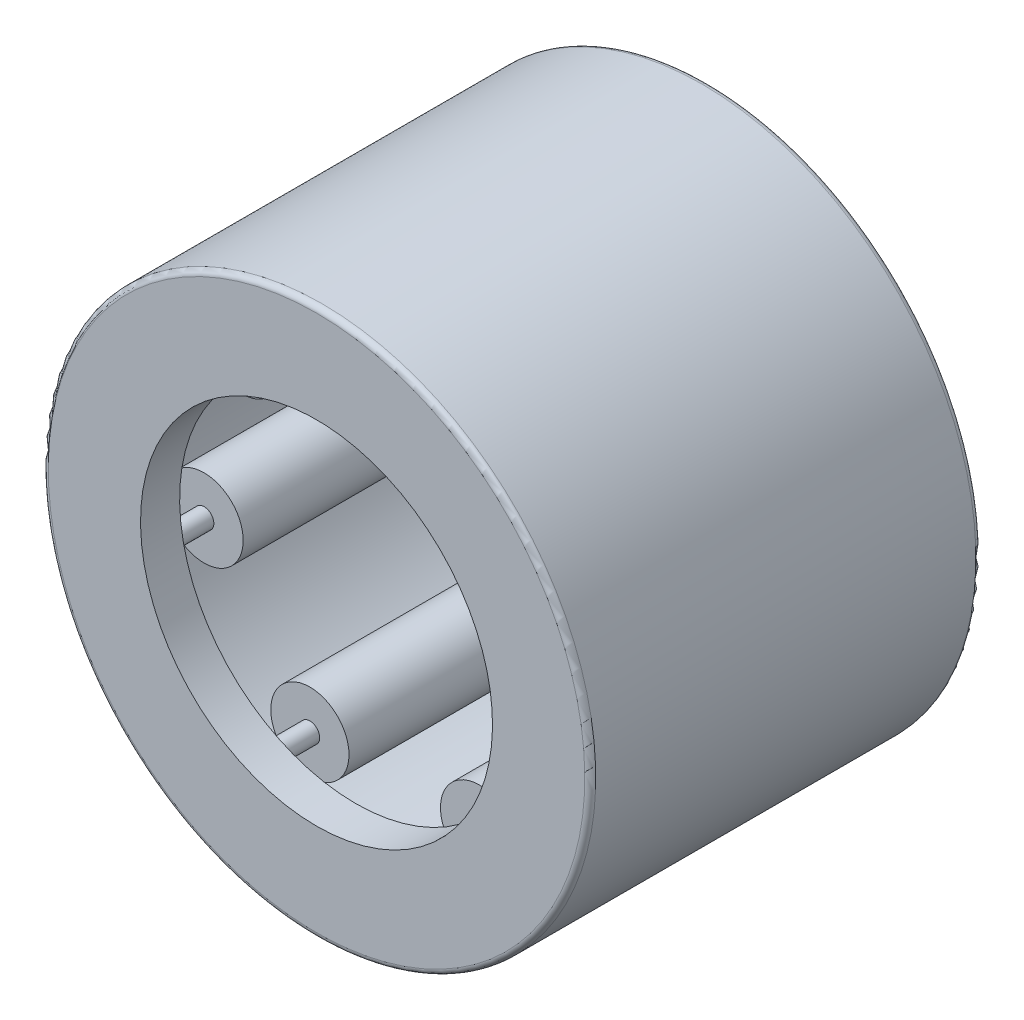
ISO-10303-21;
HEADER;
FILE_DESCRIPTION(('STEP AP214'),'2;1');
FILE_NAME('part.step','',(''),(''),'','','');
FILE_SCHEMA(('AUTOMOTIVE_DESIGN { 1 0 10303 214 1 1 1 1 }'));
ENDSEC;
DATA;
#1=APPLICATION_CONTEXT('core data for automotive mechanical design processes');
#2=APPLICATION_PROTOCOL_DEFINITION('international standard','automotive_design',2000,#1);
#3=PRODUCT_CONTEXT('',#1,'mechanical');
#4=PRODUCT('Part','Part','',(#3));
#5=PRODUCT_RELATED_PRODUCT_CATEGORY('part','',(#4));
#6=PRODUCT_DEFINITION_FORMATION('','',#4);
#7=PRODUCT_DEFINITION_CONTEXT('part definition',#1,'design');
#8=PRODUCT_DEFINITION('design','',#6,#7);
#9=PRODUCT_DEFINITION_SHAPE('','',#8);
#10=(LENGTH_UNIT() NAMED_UNIT(*) SI_UNIT(.MILLI.,.METRE.));
#11=(NAMED_UNIT(*) PLANE_ANGLE_UNIT() SI_UNIT($,.RADIAN.));
#12=(NAMED_UNIT(*) SI_UNIT($,.STERADIAN.) SOLID_ANGLE_UNIT());
#13=UNCERTAINTY_MEASURE_WITH_UNIT(LENGTH_MEASURE(1.E-05),#10,'distance_accuracy_value','');
#14=(GEOMETRIC_REPRESENTATION_CONTEXT(3) GLOBAL_UNCERTAINTY_ASSIGNED_CONTEXT((#13)) GLOBAL_UNIT_ASSIGNED_CONTEXT((#10,
#11,#12)) REPRESENTATION_CONTEXT('',''));
#15=CARTESIAN_POINT('',(0.,0.,0.));
#16=DIRECTION('',(0.,0.,1.));
#17=DIRECTION('',(1.,0.,0.));
#18=AXIS2_PLACEMENT_3D('',#15,#16,#17);
#19=CARTESIAN_POINT('',(-3.10289369604496,2.47447515112688,3.175));
#20=DIRECTION('',(0.,0.,-1.));
#21=DIRECTION('',(-0.623489801858743,-0.781831482468022,0.));
#22=AXIS2_PLACEMENT_3D('',#19,#20,#21);
#23=PLANE('',#22);
#24=CARTESIAN_POINT('',(-3.10289369604496,2.47447515112688,3.175));
#25=DIRECTION('',(0.,0.,1.));
#26=DIRECTION('',(0.623489801858743,0.781831482468022,0.));
#27=AXIS2_PLACEMENT_3D('',#24,#25,#26);
#28=CIRCLE('',#27,0.198437499999999);
#29=CARTESIAN_POINT('',(-2.97916993848861,2.62961983592913,3.175));
#30=VERTEX_POINT('',#29);
#31=EDGE_CURVE('E11',#30,#30,#28,.T.);
#32=ORIENTED_EDGE('',*,*,#31,.T.);
#33=EDGE_LOOP('',(#32));
#34=FACE_BOUND('',#33,.T.);
#35=ADVANCED_FACE('F48',(#34),#23,.F.);
#36=CARTESIAN_POINT('',(-3.10289369604496,2.47447515112688,3.175));
#37=DIRECTION('',(0.,0.,1.));
#38=DIRECTION('',(0.623489801858743,0.781831482468022,0.));
#39=AXIS2_PLACEMENT_3D('',#36,#37,#38);
#40=CYLINDRICAL_SURFACE('',#39,0.198437499999999);
#41=ORIENTED_EDGE('',*,*,#31,.F.);
#42=EDGE_LOOP('',(#41));
#43=FACE_BOUND('',#42,.T.);
#44=CARTESIAN_POINT('',(-3.10289369604496,2.47447515112688,-3.175));
#45=DIRECTION('',(0.,0.,1.));
#46=DIRECTION('',(0.623489801858743,0.781831482468022,0.));
#47=AXIS2_PLACEMENT_3D('',#44,#45,#46);
#48=CIRCLE('',#47,0.198437499999999);
#49=CARTESIAN_POINT('',(-2.97916993848861,2.62961983592913,-3.175));
#50=VERTEX_POINT('',#49);
#51=EDGE_CURVE('E54',#50,#50,#48,.T.);
#52=ORIENTED_EDGE('',*,*,#51,.T.);
#53=EDGE_LOOP('',(#52));
#54=FACE_BOUND('',#53,.T.);
#55=ADVANCED_FACE('F60',(#43,#54),#40,.T.);
#56=CARTESIAN_POINT('',(-3.10289369604496,2.47447515112688,-3.175));
#57=DIRECTION('',(0.,0.,1.));
#58=DIRECTION('',(0.623489801858743,0.781831482468022,0.));
#59=AXIS2_PLACEMENT_3D('',#56,#57,#58);
#60=PLANE('',#59);
#61=ORIENTED_EDGE('',*,*,#51,.F.);
#62=EDGE_LOOP('',(#61));
#63=FACE_BOUND('',#62,.T.);
#64=ADVANCED_FACE('F62',(#63),#60,.F.);
#65=CLOSED_SHELL('',(#35,#55,#64));
#66=MANIFOLD_SOLID_BREP('B2',#65);
#67=CARTESIAN_POINT('',(-3.86924515147161,-0.883129956639084,3.175));
#68=DIRECTION('',(0.,0.,-1.));
#69=DIRECTION('',(0.222520933956305,-0.974927912181826,0.));
#70=AXIS2_PLACEMENT_3D('',#67,#68,#69);
#71=PLANE('',#70);
#72=CARTESIAN_POINT('',(-3.86924515147161,-0.883129956639084,3.175));
#73=DIRECTION('',(0.,0.,1.));
#74=DIRECTION('',(-0.222520933956305,0.974927912181826,0.));
#75=AXIS2_PLACEMENT_3D('',#72,#73,#74);
#76=CIRCLE('',#75,0.198437499999999);
#77=CARTESIAN_POINT('',(-3.91340164930357,-0.689667699065504,3.175));
#78=VERTEX_POINT('',#77);
#79=EDGE_CURVE('E47',#78,#78,#76,.T.);
#80=ORIENTED_EDGE('',*,*,#79,.T.);
#81=EDGE_LOOP('',(#80));
#82=FACE_BOUND('',#81,.T.);
#83=ADVANCED_FACE('F97',(#82),#71,.F.);
#84=CARTESIAN_POINT('',(-3.86924515147161,-0.883129956639084,3.175));
#85=DIRECTION('',(0.,0.,1.));
#86=DIRECTION('',(-0.222520933956305,0.974927912181826,0.));
#87=AXIS2_PLACEMENT_3D('',#84,#85,#86);
#88=CYLINDRICAL_SURFACE('',#87,0.198437499999999);
#89=ORIENTED_EDGE('',*,*,#79,.F.);
#90=EDGE_LOOP('',(#89));
#91=FACE_BOUND('',#90,.T.);
#92=CARTESIAN_POINT('',(-3.86924515147161,-0.883129956639084,-3.175));
#93=DIRECTION('',(0.,0.,1.));
#94=DIRECTION('',(-0.222520933956305,0.974927912181826,0.));
#95=AXIS2_PLACEMENT_3D('',#92,#93,#94);
#96=CIRCLE('',#95,0.198437499999999);
#97=CARTESIAN_POINT('',(-3.91340164930357,-0.689667699065504,-3.175));
#98=VERTEX_POINT('',#97);
#99=EDGE_CURVE('E103',#98,#98,#96,.T.);
#100=ORIENTED_EDGE('',*,*,#99,.T.);
#101=EDGE_LOOP('',(#100));
#102=FACE_BOUND('',#101,.T.);
#103=ADVANCED_FACE('F109',(#91,#102),#88,.T.);
#104=CARTESIAN_POINT('',(-3.86924515147161,-0.883129956639084,-3.175));
#105=DIRECTION('',(0.,0.,1.));
#106=DIRECTION('',(-0.222520933956305,0.974927912181826,0.));
#107=AXIS2_PLACEMENT_3D('',#104,#105,#106);
#108=PLANE('',#107);
#109=ORIENTED_EDGE('',*,*,#99,.F.);
#110=EDGE_LOOP('',(#109));
#111=FACE_BOUND('',#110,.T.);
#112=ADVANCED_FACE('F111',(#111),#108,.F.);
#113=CLOSED_SHELL('',(#83,#103,#112));
#114=MANIFOLD_SOLID_BREP('B6',#113);
#115=CARTESIAN_POINT('',(-1.72197608962283,-3.57572019448771,3.175));
#116=DIRECTION('',(0.,0.,-1.));
#117=DIRECTION('',(0.900968867902416,-0.433883739117565,0.));
#118=AXIS2_PLACEMENT_3D('',#115,#116,#117);
#119=PLANE('',#118);
#120=CARTESIAN_POINT('',(-1.72197608962283,-3.57572019448771,3.175));
#121=DIRECTION('',(0.,0.,1.));
#122=DIRECTION('',(-0.900968867902416,0.433883739117565,0.));
#123=AXIS2_PLACEMENT_3D('',#120,#121,#122);
#124=CIRCLE('',#123,0.198437499999999);
#125=CARTESIAN_POINT('',(-1.90076209934722,-3.48962139000656,3.175));
#126=VERTEX_POINT('',#125);
#127=EDGE_CURVE('E96',#126,#126,#124,.T.);
#128=ORIENTED_EDGE('',*,*,#127,.T.);
#129=EDGE_LOOP('',(#128));
#130=FACE_BOUND('',#129,.T.);
#131=ADVANCED_FACE('F146',(#130),#119,.F.);
#132=CARTESIAN_POINT('',(-1.72197608962283,-3.57572019448771,3.175));
#133=DIRECTION('',(0.,0.,1.));
#134=DIRECTION('',(-0.900968867902416,0.433883739117565,0.));
#135=AXIS2_PLACEMENT_3D('',#132,#133,#134);
#136=CYLINDRICAL_SURFACE('',#135,0.198437499999999);
#137=ORIENTED_EDGE('',*,*,#127,.F.);
#138=EDGE_LOOP('',(#137));
#139=FACE_BOUND('',#138,.T.);
#140=CARTESIAN_POINT('',(-1.72197608962283,-3.57572019448771,-3.175));
#141=DIRECTION('',(0.,0.,1.));
#142=DIRECTION('',(-0.900968867902416,0.433883739117565,0.));
#143=AXIS2_PLACEMENT_3D('',#140,#141,#142);
#144=CIRCLE('',#143,0.198437499999999);
#145=CARTESIAN_POINT('',(-1.90076209934722,-3.48962139000656,-3.175));
#146=VERTEX_POINT('',#145);
#147=EDGE_CURVE('E152',#146,#146,#144,.T.);
#148=ORIENTED_EDGE('',*,*,#147,.T.);
#149=EDGE_LOOP('',(#148));
#150=FACE_BOUND('',#149,.T.);
#151=ADVANCED_FACE('F158',(#139,#150),#136,.T.);
#152=CARTESIAN_POINT('',(-1.72197608962283,-3.57572019448771,-3.175));
#153=DIRECTION('',(0.,0.,1.));
#154=DIRECTION('',(-0.900968867902416,0.433883739117565,0.));
#155=AXIS2_PLACEMENT_3D('',#152,#153,#154);
#156=PLANE('',#155);
#157=ORIENTED_EDGE('',*,*,#147,.F.);
#158=EDGE_LOOP('',(#157));
#159=FACE_BOUND('',#158,.T.);
#160=ADVANCED_FACE('F160',(#159),#156,.F.);
#161=CLOSED_SHELL('',(#131,#151,#160));
#162=MANIFOLD_SOLID_BREP('B42',#161);
#163=CARTESIAN_POINT('',(1.72197608962278,-3.57572019448773,3.175));
#164=DIRECTION('',(0.,0.,-1.));
#165=DIRECTION('',(0.900968867902422,0.433883739117553,0.));
#166=AXIS2_PLACEMENT_3D('',#163,#164,#165);
#167=PLANE('',#166);
#168=CARTESIAN_POINT('',(1.72197608962278,-3.57572019448773,3.175));
#169=DIRECTION('',(0.,0.,1.));
#170=DIRECTION('',(-0.900968867902422,-0.433883739117553,0.));
#171=AXIS2_PLACEMENT_3D('',#168,#169,#170);
#172=CIRCLE('',#171,0.198437499999999);
#173=CARTESIAN_POINT('',(1.5431900798984,-3.66181899896887,3.175));
#174=VERTEX_POINT('',#173);
#175=EDGE_CURVE('E145',#174,#174,#172,.T.);
#176=ORIENTED_EDGE('',*,*,#175,.T.);
#177=EDGE_LOOP('',(#176));
#178=FACE_BOUND('',#177,.T.);
#179=ADVANCED_FACE('F195',(#178),#167,.F.);
#180=CARTESIAN_POINT('',(1.72197608962278,-3.57572019448773,3.175));
#181=DIRECTION('',(0.,0.,1.));
#182=DIRECTION('',(-0.900968867902422,-0.433883739117553,0.));
#183=AXIS2_PLACEMENT_3D('',#180,#181,#182);
#184=CYLINDRICAL_SURFACE('',#183,0.198437499999999);
#185=ORIENTED_EDGE('',*,*,#175,.F.);
#186=EDGE_LOOP('',(#185));
#187=FACE_BOUND('',#186,.T.);
#188=CARTESIAN_POINT('',(1.72197608962278,-3.57572019448773,-3.175));
#189=DIRECTION('',(0.,0.,1.));
#190=DIRECTION('',(-0.900968867902422,-0.433883739117553,0.));
#191=AXIS2_PLACEMENT_3D('',#188,#189,#190);
#192=CIRCLE('',#191,0.198437499999999);
#193=CARTESIAN_POINT('',(1.5431900798984,-3.66181899896887,-3.175));
#194=VERTEX_POINT('',#193);
#195=EDGE_CURVE('E201',#194,#194,#192,.T.);
#196=ORIENTED_EDGE('',*,*,#195,.T.);
#197=EDGE_LOOP('',(#196));
#198=FACE_BOUND('',#197,.T.);
#199=ADVANCED_FACE('F207',(#187,#198),#184,.T.);
#200=CARTESIAN_POINT('',(1.72197608962278,-3.57572019448773,-3.175));
#201=DIRECTION('',(0.,0.,1.));
#202=DIRECTION('',(-0.900968867902422,-0.433883739117553,0.));
#203=AXIS2_PLACEMENT_3D('',#200,#201,#202);
#204=PLANE('',#203);
#205=ORIENTED_EDGE('',*,*,#195,.F.);
#206=EDGE_LOOP('',(#205));
#207=FACE_BOUND('',#206,.T.);
#208=ADVANCED_FACE('F209',(#207),#204,.F.);
#209=CLOSED_SHELL('',(#179,#199,#208));
#210=MANIFOLD_SOLID_BREP('B91',#209);
#211=CARTESIAN_POINT('',(3.8692451514716,-0.883129956639136,3.175));
#212=DIRECTION('',(0.,0.,-1.));
#213=DIRECTION('',(0.222520933956318,0.974927912181823,0.));
#214=AXIS2_PLACEMENT_3D('',#211,#212,#213);
#215=PLANE('',#214);
#216=CARTESIAN_POINT('',(3.8692451514716,-0.883129956639136,3.175));
#217=DIRECTION('',(0.,0.,1.));
#218=DIRECTION('',(-0.222520933956318,-0.974927912181823,0.));
#219=AXIS2_PLACEMENT_3D('',#216,#217,#218);
#220=CIRCLE('',#219,0.198437499999999);
#221=CARTESIAN_POINT('',(3.82508865363965,-1.07659221421272,3.175));
#222=VERTEX_POINT('',#221);
#223=EDGE_CURVE('E194',#222,#222,#220,.T.);
#224=ORIENTED_EDGE('',*,*,#223,.T.);
#225=EDGE_LOOP('',(#224));
#226=FACE_BOUND('',#225,.T.);
#227=ADVANCED_FACE('F244',(#226),#215,.F.);
#228=CARTESIAN_POINT('',(3.8692451514716,-0.883129956639136,3.175));
#229=DIRECTION('',(0.,0.,1.));
#230=DIRECTION('',(-0.222520933956318,-0.974927912181823,0.));
#231=AXIS2_PLACEMENT_3D('',#228,#229,#230);
#232=CYLINDRICAL_SURFACE('',#231,0.198437499999999);
#233=ORIENTED_EDGE('',*,*,#223,.F.);
#234=EDGE_LOOP('',(#233));
#235=FACE_BOUND('',#234,.T.);
#236=CARTESIAN_POINT('',(3.8692451514716,-0.883129956639136,-3.175));
#237=DIRECTION('',(0.,0.,1.));
#238=DIRECTION('',(-0.222520933956318,-0.974927912181823,0.));
#239=AXIS2_PLACEMENT_3D('',#236,#237,#238);
#240=CIRCLE('',#239,0.198437499999999);
#241=CARTESIAN_POINT('',(3.82508865363965,-1.07659221421272,-3.175));
#242=VERTEX_POINT('',#241);
#243=EDGE_CURVE('E250',#242,#242,#240,.T.);
#244=ORIENTED_EDGE('',*,*,#243,.T.);
#245=EDGE_LOOP('',(#244));
#246=FACE_BOUND('',#245,.T.);
#247=ADVANCED_FACE('F256',(#235,#246),#232,.T.);
#248=CARTESIAN_POINT('',(3.8692451514716,-0.883129956639136,-3.175));
#249=DIRECTION('',(0.,0.,1.));
#250=DIRECTION('',(-0.222520933956318,-0.974927912181823,0.));
#251=AXIS2_PLACEMENT_3D('',#248,#249,#250);
#252=PLANE('',#251);
#253=ORIENTED_EDGE('',*,*,#243,.F.);
#254=EDGE_LOOP('',(#253));
#255=FACE_BOUND('',#254,.T.);
#256=ADVANCED_FACE('F258',(#255),#252,.F.);
#257=CLOSED_SHELL('',(#227,#247,#256));
#258=MANIFOLD_SOLID_BREP('B140',#257);
#259=CARTESIAN_POINT('',(3.10289369604499,2.47447515112684,3.175));
#260=DIRECTION('',(0.,0.,-1.));
#261=DIRECTION('',(-0.623489801858732,0.781831482468031,0.));
#262=AXIS2_PLACEMENT_3D('',#259,#260,#261);
#263=PLANE('',#262);
#264=CARTESIAN_POINT('',(3.10289369604499,2.47447515112684,3.175));
#265=DIRECTION('',(0.,0.,1.));
#266=DIRECTION('',(0.623489801858732,-0.781831482468031,0.));
#267=AXIS2_PLACEMENT_3D('',#264,#265,#266);
#268=CIRCLE('',#267,0.198437499999999);
#269=CARTESIAN_POINT('',(3.22661745360133,2.31933046632459,3.175));
#270=VERTEX_POINT('',#269);
#271=EDGE_CURVE('E243',#270,#270,#268,.T.);
#272=ORIENTED_EDGE('',*,*,#271,.T.);
#273=EDGE_LOOP('',(#272));
#274=FACE_BOUND('',#273,.T.);
#275=ADVANCED_FACE('F293',(#274),#263,.F.);
#276=CARTESIAN_POINT('',(3.10289369604499,2.47447515112684,3.175));
#277=DIRECTION('',(0.,0.,1.));
#278=DIRECTION('',(0.623489801858732,-0.781831482468031,0.));
#279=AXIS2_PLACEMENT_3D('',#276,#277,#278);
#280=CYLINDRICAL_SURFACE('',#279,0.198437499999999);
#281=ORIENTED_EDGE('',*,*,#271,.F.);
#282=EDGE_LOOP('',(#281));
#283=FACE_BOUND('',#282,.T.);
#284=CARTESIAN_POINT('',(3.10289369604499,2.47447515112684,-3.175));
#285=DIRECTION('',(0.,0.,1.));
#286=DIRECTION('',(0.623489801858732,-0.781831482468031,0.));
#287=AXIS2_PLACEMENT_3D('',#284,#285,#286);
#288=CIRCLE('',#287,0.198437499999999);
#289=CARTESIAN_POINT('',(3.22661745360133,2.31933046632459,-3.175));
#290=VERTEX_POINT('',#289);
#291=EDGE_CURVE('E299',#290,#290,#288,.T.);
#292=ORIENTED_EDGE('',*,*,#291,.T.);
#293=EDGE_LOOP('',(#292));
#294=FACE_BOUND('',#293,.T.);
#295=ADVANCED_FACE('F305',(#283,#294),#280,.T.);
#296=CARTESIAN_POINT('',(3.10289369604499,2.47447515112684,-3.175));
#297=DIRECTION('',(0.,0.,1.));
#298=DIRECTION('',(0.623489801858732,-0.781831482468031,0.));
#299=AXIS2_PLACEMENT_3D('',#296,#297,#298);
#300=PLANE('',#299);
#301=ORIENTED_EDGE('',*,*,#291,.F.);
#302=EDGE_LOOP('',(#301));
#303=FACE_BOUND('',#302,.T.);
#304=ADVANCED_FACE('F307',(#303),#300,.F.);
#305=CLOSED_SHELL('',(#275,#295,#304));
#306=MANIFOLD_SOLID_BREP('B189',#305);
#307=CARTESIAN_POINT('',(-3.72347243525395,2.96937018135226,-2.38125));
#308=DIRECTION('',(0.,0.,1.));
#309=DIRECTION('',(0.623489801858743,0.781831482468022,0.));
#310=AXIS2_PLACEMENT_3D('',#307,#308,#309);
#311=PLANE('',#310);
#312=CARTESIAN_POINT('',(-3.10289369604496,2.47447515112688,-2.38125));
#313=DIRECTION('',(0.,0.,1.));
#314=DIRECTION('',(0.623489801858743,0.781831482468022,0.));
#315=AXIS2_PLACEMENT_3D('',#312,#313,#314);
#316=CIRCLE('',#315,0.793749999999996);
#317=CARTESIAN_POINT('',(-2.60799866581958,3.09505389033587,-2.38125));
#318=VERTEX_POINT('',#317);
#319=EDGE_CURVE('E356',#318,#318,#316,.T.);
#320=ORIENTED_EDGE('',*,*,#319,.F.);
#321=EDGE_LOOP('',(#320));
#322=FACE_BOUND('',#321,.T.);
#323=CARTESIAN_POINT('',(-3.10289369604496,2.47447515112688,-2.38125));
#324=DIRECTION('',(0.,0.,1.));
#325=DIRECTION('',(0.623489801858743,0.781831482468022,0.));
#326=AXIS2_PLACEMENT_3D('',#323,#324,#325);
#327=CIRCLE('',#326,0.198437499999999);
#328=CARTESIAN_POINT('',(-2.97916993848861,2.62961983592913,-2.38125));
#329=VERTEX_POINT('',#328);
#330=EDGE_CURVE('E292',#329,#329,#327,.T.);
#331=ORIENTED_EDGE('',*,*,#330,.T.);
#332=EDGE_LOOP('',(#331));
#333=FACE_BOUND('',#332,.T.);
#334=ADVANCED_FACE('F342',(#322,#333),#311,.F.);
#335=CARTESIAN_POINT('',(-3.10289369604496,2.47447515112688,2.38125));
#336=DIRECTION('',(0.,0.,1.));
#337=DIRECTION('',(0.623489801858743,0.781831482468022,0.));
#338=AXIS2_PLACEMENT_3D('',#335,#336,#337);
#339=CYLINDRICAL_SURFACE('',#338,0.198437499999999);
#340=ORIENTED_EDGE('',*,*,#330,.F.);
#341=EDGE_LOOP('',(#340));
#342=FACE_BOUND('',#341,.T.);
#343=CARTESIAN_POINT('',(-3.10289369604496,2.47447515112688,2.38125));
#344=DIRECTION('',(0.,0.,1.));
#345=DIRECTION('',(0.623489801858743,0.781831482468022,0.));
#346=AXIS2_PLACEMENT_3D('',#343,#344,#345);
#347=CIRCLE('',#346,0.198437499999999);
#348=CARTESIAN_POINT('',(-2.97916993848861,2.62961983592913,2.38125));
#349=VERTEX_POINT('',#348);
#350=EDGE_CURVE('E348',#349,#349,#347,.T.);
#351=ORIENTED_EDGE('',*,*,#350,.T.);
#352=EDGE_LOOP('',(#351));
#353=FACE_BOUND('',#352,.T.);
#354=ADVANCED_FACE('F365',(#342,#353),#339,.F.);
#355=CARTESIAN_POINT('',(-3.72347243525395,2.96937018135226,2.38125));
#356=DIRECTION('',(0.,0.,-1.));
#357=DIRECTION('',(-0.623489801858743,-0.781831482468022,0.));
#358=AXIS2_PLACEMENT_3D('',#355,#356,#357);
#359=PLANE('',#358);
#360=ORIENTED_EDGE('',*,*,#350,.F.);
#361=EDGE_LOOP('',(#360));
#362=FACE_BOUND('',#361,.T.);
#363=CARTESIAN_POINT('',(-3.10289369604496,2.47447515112688,2.38125));
#364=DIRECTION('',(0.,0.,1.));
#365=DIRECTION('',(0.623489801858743,0.781831482468022,0.));
#366=AXIS2_PLACEMENT_3D('',#363,#364,#365);
#367=CIRCLE('',#366,0.793749999999996);
#368=CARTESIAN_POINT('',(-2.60799866581958,3.09505389033587,2.38125));
#369=VERTEX_POINT('',#368);
#370=EDGE_CURVE('E352',#369,#369,#367,.T.);
#371=ORIENTED_EDGE('',*,*,#370,.T.);
#372=EDGE_LOOP('',(#371));
#373=FACE_BOUND('',#372,.T.);
#374=ADVANCED_FACE('F369',(#362,#373),#359,.F.);
#375=CARTESIAN_POINT('',(-3.10289369604496,2.47447515112688,2.38125));
#376=DIRECTION('',(0.,0.,1.));
#377=DIRECTION('',(0.623489801858743,0.781831482468022,0.));
#378=AXIS2_PLACEMENT_3D('',#375,#376,#377);
#379=CYLINDRICAL_SURFACE('',#378,0.793749999999996);
#380=ORIENTED_EDGE('',*,*,#370,.F.);
#381=EDGE_LOOP('',(#380));
#382=FACE_BOUND('',#381,.T.);
#383=ORIENTED_EDGE('',*,*,#319,.T.);
#384=EDGE_LOOP('',(#383));
#385=FACE_BOUND('',#384,.T.);
#386=ADVANCED_FACE('F362',(#382,#385),#379,.T.);
#387=CLOSED_SHELL('',(#334,#354,#374,#386));
#388=MANIFOLD_SOLID_BREP('B238',#387);
#389=CARTESIAN_POINT('',(-4.64309418176593,-1.0597559479669,-2.38125));
#390=DIRECTION('',(0.,0.,1.));
#391=DIRECTION('',(-0.222520933956305,0.974927912181826,0.));
#392=AXIS2_PLACEMENT_3D('',#389,#390,#391);
#393=PLANE('',#392);
#394=CARTESIAN_POINT('',(-3.86924515147161,-0.883129956639084,-2.38125));
#395=DIRECTION('',(0.,0.,1.));
#396=DIRECTION('',(-0.222520933956305,0.974927912181826,0.));
#397=AXIS2_PLACEMENT_3D('',#394,#395,#396);
#398=CIRCLE('',#397,0.793749999999996);
#399=CARTESIAN_POINT('',(-4.04587114279943,-0.109280926344764,-2.38125));
#400=VERTEX_POINT('',#399);
#401=EDGE_CURVE('E426',#400,#400,#398,.T.);
#402=ORIENTED_EDGE('',*,*,#401,.F.);
#403=EDGE_LOOP('',(#402));
#404=FACE_BOUND('',#403,.T.);
#405=CARTESIAN_POINT('',(-3.86924515147161,-0.883129956639084,-2.38125));
#406=DIRECTION('',(0.,0.,1.));
#407=DIRECTION('',(-0.222520933956305,0.974927912181826,0.));
#408=AXIS2_PLACEMENT_3D('',#405,#406,#407);
#409=CIRCLE('',#408,0.198437499999999);
#410=CARTESIAN_POINT('',(-3.91340164930357,-0.689667699065504,-2.38125));
#411=VERTEX_POINT('',#410);
#412=EDGE_CURVE('E341',#411,#411,#409,.T.);
#413=ORIENTED_EDGE('',*,*,#412,.T.);
#414=EDGE_LOOP('',(#413));
#415=FACE_BOUND('',#414,.T.);
#416=ADVANCED_FACE('F412',(#404,#415),#393,.F.);
#417=CARTESIAN_POINT('',(-3.86924515147161,-0.883129956639084,2.38125));
#418=DIRECTION('',(0.,0.,1.));
#419=DIRECTION('',(-0.222520933956305,0.974927912181826,0.));
#420=AXIS2_PLACEMENT_3D('',#417,#418,#419);
#421=CYLINDRICAL_SURFACE('',#420,0.198437499999999);
#422=ORIENTED_EDGE('',*,*,#412,.F.);
#423=EDGE_LOOP('',(#422));
#424=FACE_BOUND('',#423,.T.);
#425=CARTESIAN_POINT('',(-3.86924515147161,-0.883129956639084,2.38125));
#426=DIRECTION('',(0.,0.,1.));
#427=DIRECTION('',(-0.222520933956305,0.974927912181826,0.));
#428=AXIS2_PLACEMENT_3D('',#425,#426,#427);
#429=CIRCLE('',#428,0.198437499999999);
#430=CARTESIAN_POINT('',(-3.91340164930357,-0.689667699065504,2.38125));
#431=VERTEX_POINT('',#430);
#432=EDGE_CURVE('E418',#431,#431,#429,.T.);
#433=ORIENTED_EDGE('',*,*,#432,.T.);
#434=EDGE_LOOP('',(#433));
#435=FACE_BOUND('',#434,.T.);
#436=ADVANCED_FACE('F435',(#424,#435),#421,.F.);
#437=CARTESIAN_POINT('',(-4.64309418176593,-1.0597559479669,2.38125));
#438=DIRECTION('',(0.,0.,-1.));
#439=DIRECTION('',(0.222520933956305,-0.974927912181826,0.));
#440=AXIS2_PLACEMENT_3D('',#437,#438,#439);
#441=PLANE('',#440);
#442=ORIENTED_EDGE('',*,*,#432,.F.);
#443=EDGE_LOOP('',(#442));
#444=FACE_BOUND('',#443,.T.);
#445=CARTESIAN_POINT('',(-3.86924515147161,-0.883129956639084,2.38125));
#446=DIRECTION('',(0.,0.,1.));
#447=DIRECTION('',(-0.222520933956305,0.974927912181826,0.));
#448=AXIS2_PLACEMENT_3D('',#445,#446,#447);
#449=CIRCLE('',#448,0.793749999999996);
#450=CARTESIAN_POINT('',(-4.04587114279943,-0.109280926344764,2.38125));
#451=VERTEX_POINT('',#450);
#452=EDGE_CURVE('E422',#451,#451,#449,.T.);
#453=ORIENTED_EDGE('',*,*,#452,.T.);
#454=EDGE_LOOP('',(#453));
#455=FACE_BOUND('',#454,.T.);
#456=ADVANCED_FACE('F439',(#444,#455),#441,.F.);
#457=CARTESIAN_POINT('',(-3.86924515147161,-0.883129956639084,2.38125));
#458=DIRECTION('',(0.,0.,1.));
#459=DIRECTION('',(-0.222520933956305,0.974927912181826,0.));
#460=AXIS2_PLACEMENT_3D('',#457,#458,#459);
#461=CYLINDRICAL_SURFACE('',#460,0.793749999999996);
#462=ORIENTED_EDGE('',*,*,#452,.F.);
#463=EDGE_LOOP('',(#462));
#464=FACE_BOUND('',#463,.T.);
#465=ORIENTED_EDGE('',*,*,#401,.T.);
#466=EDGE_LOOP('',(#465));
#467=FACE_BOUND('',#466,.T.);
#468=ADVANCED_FACE('F432',(#464,#467),#461,.T.);
#469=CLOSED_SHELL('',(#416,#436,#456,#468));
#470=MANIFOLD_SOLID_BREP('B287',#469);
#471=CARTESIAN_POINT('',(-2.0663713075474,-4.29086423338524,-2.38125));
#472=DIRECTION('',(0.,0.,1.));
#473=DIRECTION('',(-0.900968867902416,0.433883739117565,0.));
#474=AXIS2_PLACEMENT_3D('',#471,#472,#473);
#475=PLANE('',#474);
#476=CARTESIAN_POINT('',(-1.72197608962283,-3.57572019448771,-2.38125));
#477=DIRECTION('',(0.,0.,1.));
#478=DIRECTION('',(-0.900968867902416,0.433883739117565,0.));
#479=AXIS2_PLACEMENT_3D('',#476,#477,#478);
#480=CIRCLE('',#479,0.793749999999996);
#481=CARTESIAN_POINT('',(-2.43712012852037,-3.23132497656314,-2.38125));
#482=VERTEX_POINT('',#481);
#483=EDGE_CURVE('E496',#482,#482,#480,.T.);
#484=ORIENTED_EDGE('',*,*,#483,.F.);
#485=EDGE_LOOP('',(#484));
#486=FACE_BOUND('',#485,.T.);
#487=CARTESIAN_POINT('',(-1.72197608962283,-3.57572019448771,-2.38125));
#488=DIRECTION('',(0.,0.,1.));
#489=DIRECTION('',(-0.900968867902416,0.433883739117565,0.));
#490=AXIS2_PLACEMENT_3D('',#487,#488,#489);
#491=CIRCLE('',#490,0.198437499999999);
#492=CARTESIAN_POINT('',(-1.90076209934722,-3.48962139000656,-2.38125));
#493=VERTEX_POINT('',#492);
#494=EDGE_CURVE('E411',#493,#493,#491,.T.);
#495=ORIENTED_EDGE('',*,*,#494,.T.);
#496=EDGE_LOOP('',(#495));
#497=FACE_BOUND('',#496,.T.);
#498=ADVANCED_FACE('F482',(#486,#497),#475,.F.);
#499=CARTESIAN_POINT('',(-1.72197608962283,-3.57572019448771,2.38125));
#500=DIRECTION('',(0.,0.,1.));
#501=DIRECTION('',(-0.900968867902416,0.433883739117565,0.));
#502=AXIS2_PLACEMENT_3D('',#499,#500,#501);
#503=CYLINDRICAL_SURFACE('',#502,0.198437499999999);
#504=ORIENTED_EDGE('',*,*,#494,.F.);
#505=EDGE_LOOP('',(#504));
#506=FACE_BOUND('',#505,.T.);
#507=CARTESIAN_POINT('',(-1.72197608962283,-3.57572019448771,2.38125));
#508=DIRECTION('',(0.,0.,1.));
#509=DIRECTION('',(-0.900968867902416,0.433883739117565,0.));
#510=AXIS2_PLACEMENT_3D('',#507,#508,#509);
#511=CIRCLE('',#510,0.198437499999999);
#512=CARTESIAN_POINT('',(-1.90076209934722,-3.48962139000656,2.38125));
#513=VERTEX_POINT('',#512);
#514=EDGE_CURVE('E488',#513,#513,#511,.T.);
#515=ORIENTED_EDGE('',*,*,#514,.T.);
#516=EDGE_LOOP('',(#515));
#517=FACE_BOUND('',#516,.T.);
#518=ADVANCED_FACE('F505',(#506,#517),#503,.F.);
#519=CARTESIAN_POINT('',(-2.0663713075474,-4.29086423338524,2.38125));
#520=DIRECTION('',(0.,0.,-1.));
#521=DIRECTION('',(0.900968867902416,-0.433883739117565,0.));
#522=AXIS2_PLACEMENT_3D('',#519,#520,#521);
#523=PLANE('',#522);
#524=ORIENTED_EDGE('',*,*,#514,.F.);
#525=EDGE_LOOP('',(#524));
#526=FACE_BOUND('',#525,.T.);
#527=CARTESIAN_POINT('',(-1.72197608962283,-3.57572019448771,2.38125));
#528=DIRECTION('',(0.,0.,1.));
#529=DIRECTION('',(-0.900968867902416,0.433883739117565,0.));
#530=AXIS2_PLACEMENT_3D('',#527,#528,#529);
#531=CIRCLE('',#530,0.793749999999996);
#532=CARTESIAN_POINT('',(-2.43712012852037,-3.23132497656314,2.38125));
#533=VERTEX_POINT('',#532);
#534=EDGE_CURVE('E492',#533,#533,#531,.T.);
#535=ORIENTED_EDGE('',*,*,#534,.T.);
#536=EDGE_LOOP('',(#535));
#537=FACE_BOUND('',#536,.T.);
#538=ADVANCED_FACE('F509',(#526,#537),#523,.F.);
#539=CARTESIAN_POINT('',(-1.72197608962283,-3.57572019448771,2.38125));
#540=DIRECTION('',(0.,0.,1.));
#541=DIRECTION('',(-0.900968867902416,0.433883739117565,0.));
#542=AXIS2_PLACEMENT_3D('',#539,#540,#541);
#543=CYLINDRICAL_SURFACE('',#542,0.793749999999996);
#544=ORIENTED_EDGE('',*,*,#534,.F.);
#545=EDGE_LOOP('',(#544));
#546=FACE_BOUND('',#545,.T.);
#547=ORIENTED_EDGE('',*,*,#483,.T.);
#548=EDGE_LOOP('',(#547));
#549=FACE_BOUND('',#548,.T.);
#550=ADVANCED_FACE('F502',(#546,#549),#543,.T.);
#551=CLOSED_SHELL('',(#498,#518,#538,#550));
#552=MANIFOLD_SOLID_BREP('B336',#551);
#553=CARTESIAN_POINT('',(2.06637130754734,-4.29086423338527,-2.38125));
#554=DIRECTION('',(0.,0.,1.));
#555=DIRECTION('',(-0.900968867902422,-0.433883739117553,0.));
#556=AXIS2_PLACEMENT_3D('',#553,#554,#555);
#557=PLANE('',#556);
#558=CARTESIAN_POINT('',(1.72197608962278,-3.57572019448773,-2.38125));
#559=DIRECTION('',(0.,0.,1.));
#560=DIRECTION('',(-0.900968867902422,-0.433883739117553,0.));
#561=AXIS2_PLACEMENT_3D('',#558,#559,#560);
#562=CIRCLE('',#561,0.793749999999996);
#563=CARTESIAN_POINT('',(1.00683205072524,-3.92011541241229,-2.38125));
#564=VERTEX_POINT('',#563);
#565=EDGE_CURVE('E566',#564,#564,#562,.T.);
#566=ORIENTED_EDGE('',*,*,#565,.F.);
#567=EDGE_LOOP('',(#566));
#568=FACE_BOUND('',#567,.T.);
#569=CARTESIAN_POINT('',(1.72197608962278,-3.57572019448773,-2.38125));
#570=DIRECTION('',(0.,0.,1.));
#571=DIRECTION('',(-0.900968867902422,-0.433883739117553,0.));
#572=AXIS2_PLACEMENT_3D('',#569,#570,#571);
#573=CIRCLE('',#572,0.198437499999999);
#574=CARTESIAN_POINT('',(1.5431900798984,-3.66181899896887,-2.38125));
#575=VERTEX_POINT('',#574);
#576=EDGE_CURVE('E481',#575,#575,#573,.T.);
#577=ORIENTED_EDGE('',*,*,#576,.T.);
#578=EDGE_LOOP('',(#577));
#579=FACE_BOUND('',#578,.T.);
#580=ADVANCED_FACE('F552',(#568,#579),#557,.F.);
#581=CARTESIAN_POINT('',(1.72197608962278,-3.57572019448773,2.38125));
#582=DIRECTION('',(0.,0.,1.));
#583=DIRECTION('',(-0.900968867902422,-0.433883739117553,0.));
#584=AXIS2_PLACEMENT_3D('',#581,#582,#583);
#585=CYLINDRICAL_SURFACE('',#584,0.198437499999999);
#586=ORIENTED_EDGE('',*,*,#576,.F.);
#587=EDGE_LOOP('',(#586));
#588=FACE_BOUND('',#587,.T.);
#589=CARTESIAN_POINT('',(1.72197608962278,-3.57572019448773,2.38125));
#590=DIRECTION('',(0.,0.,1.));
#591=DIRECTION('',(-0.900968867902422,-0.433883739117553,0.));
#592=AXIS2_PLACEMENT_3D('',#589,#590,#591);
#593=CIRCLE('',#592,0.198437499999999);
#594=CARTESIAN_POINT('',(1.5431900798984,-3.66181899896887,2.38125));
#595=VERTEX_POINT('',#594);
#596=EDGE_CURVE('E558',#595,#595,#593,.T.);
#597=ORIENTED_EDGE('',*,*,#596,.T.);
#598=EDGE_LOOP('',(#597));
#599=FACE_BOUND('',#598,.T.);
#600=ADVANCED_FACE('F575',(#588,#599),#585,.F.);
#601=CARTESIAN_POINT('',(2.06637130754734,-4.29086423338527,2.38125));
#602=DIRECTION('',(0.,0.,-1.));
#603=DIRECTION('',(0.900968867902422,0.433883739117553,0.));
#604=AXIS2_PLACEMENT_3D('',#601,#602,#603);
#605=PLANE('',#604);
#606=ORIENTED_EDGE('',*,*,#596,.F.);
#607=EDGE_LOOP('',(#606));
#608=FACE_BOUND('',#607,.T.);
#609=CARTESIAN_POINT('',(1.72197608962278,-3.57572019448773,2.38125));
#610=DIRECTION('',(0.,0.,1.));
#611=DIRECTION('',(-0.900968867902422,-0.433883739117553,0.));
#612=AXIS2_PLACEMENT_3D('',#609,#610,#611);
#613=CIRCLE('',#612,0.793749999999996);
#614=CARTESIAN_POINT('',(1.00683205072524,-3.92011541241229,2.38125));
#615=VERTEX_POINT('',#614);
#616=EDGE_CURVE('E562',#615,#615,#613,.T.);
#617=ORIENTED_EDGE('',*,*,#616,.T.);
#618=EDGE_LOOP('',(#617));
#619=FACE_BOUND('',#618,.T.);
#620=ADVANCED_FACE('F579',(#608,#619),#605,.F.);
#621=CARTESIAN_POINT('',(1.72197608962278,-3.57572019448773,2.38125));
#622=DIRECTION('',(0.,0.,1.));
#623=DIRECTION('',(-0.900968867902422,-0.433883739117553,0.));
#624=AXIS2_PLACEMENT_3D('',#621,#622,#623);
#625=CYLINDRICAL_SURFACE('',#624,0.793749999999996);
#626=ORIENTED_EDGE('',*,*,#616,.F.);
#627=EDGE_LOOP('',(#626));
#628=FACE_BOUND('',#627,.T.);
#629=ORIENTED_EDGE('',*,*,#565,.T.);
#630=EDGE_LOOP('',(#629));
#631=FACE_BOUND('',#630,.T.);
#632=ADVANCED_FACE('F572',(#628,#631),#625,.T.);
#633=CLOSED_SHELL('',(#580,#600,#620,#632));
#634=MANIFOLD_SOLID_BREP('B406',#633);
#635=CARTESIAN_POINT('',(4.64309418176592,-1.05975594796696,-2.38125));
#636=DIRECTION('',(0.,0.,1.));
#637=DIRECTION('',(-0.222520933956318,-0.974927912181823,0.));
#638=AXIS2_PLACEMENT_3D('',#635,#636,#637);
#639=PLANE('',#638);
#640=CARTESIAN_POINT('',(3.8692451514716,-0.883129956639136,-2.38125));
#641=DIRECTION('',(0.,0.,1.));
#642=DIRECTION('',(-0.222520933956318,-0.974927912181823,0.));
#643=AXIS2_PLACEMENT_3D('',#640,#641,#642);
#644=CIRCLE('',#643,0.793749999999996);
#645=CARTESIAN_POINT('',(3.69261916014378,-1.65697898693345,-2.38125));
#646=VERTEX_POINT('',#645);
#647=EDGE_CURVE('E636',#646,#646,#644,.T.);
#648=ORIENTED_EDGE('',*,*,#647,.F.);
#649=EDGE_LOOP('',(#648));
#650=FACE_BOUND('',#649,.T.);
#651=CARTESIAN_POINT('',(3.8692451514716,-0.883129956639136,-2.38125));
#652=DIRECTION('',(0.,0.,1.));
#653=DIRECTION('',(-0.222520933956318,-0.974927912181823,0.));
#654=AXIS2_PLACEMENT_3D('',#651,#652,#653);
#655=CIRCLE('',#654,0.198437499999999);
#656=CARTESIAN_POINT('',(3.82508865363965,-1.07659221421272,-2.38125));
#657=VERTEX_POINT('',#656);
#658=EDGE_CURVE('E551',#657,#657,#655,.T.);
#659=ORIENTED_EDGE('',*,*,#658,.T.);
#660=EDGE_LOOP('',(#659));
#661=FACE_BOUND('',#660,.T.);
#662=ADVANCED_FACE('F622',(#650,#661),#639,.F.);
#663=CARTESIAN_POINT('',(3.8692451514716,-0.883129956639136,2.38125));
#664=DIRECTION('',(0.,0.,1.));
#665=DIRECTION('',(-0.222520933956318,-0.974927912181823,0.));
#666=AXIS2_PLACEMENT_3D('',#663,#664,#665);
#667=CYLINDRICAL_SURFACE('',#666,0.198437499999999);
#668=ORIENTED_EDGE('',*,*,#658,.F.);
#669=EDGE_LOOP('',(#668));
#670=FACE_BOUND('',#669,.T.);
#671=CARTESIAN_POINT('',(3.8692451514716,-0.883129956639136,2.38125));
#672=DIRECTION('',(0.,0.,1.));
#673=DIRECTION('',(-0.222520933956318,-0.974927912181823,0.));
#674=AXIS2_PLACEMENT_3D('',#671,#672,#673);
#675=CIRCLE('',#674,0.198437499999999);
#676=CARTESIAN_POINT('',(3.82508865363965,-1.07659221421272,2.38125));
#677=VERTEX_POINT('',#676);
#678=EDGE_CURVE('E628',#677,#677,#675,.T.);
#679=ORIENTED_EDGE('',*,*,#678,.T.);
#680=EDGE_LOOP('',(#679));
#681=FACE_BOUND('',#680,.T.);
#682=ADVANCED_FACE('F645',(#670,#681),#667,.F.);
#683=CARTESIAN_POINT('',(4.64309418176592,-1.05975594796696,2.38125));
#684=DIRECTION('',(0.,0.,-1.));
#685=DIRECTION('',(0.222520933956318,0.974927912181823,0.));
#686=AXIS2_PLACEMENT_3D('',#683,#684,#685);
#687=PLANE('',#686);
#688=ORIENTED_EDGE('',*,*,#678,.F.);
#689=EDGE_LOOP('',(#688));
#690=FACE_BOUND('',#689,.T.);
#691=CARTESIAN_POINT('',(3.8692451514716,-0.883129956639136,2.38125));
#692=DIRECTION('',(0.,0.,1.));
#693=DIRECTION('',(-0.222520933956318,-0.974927912181823,0.));
#694=AXIS2_PLACEMENT_3D('',#691,#692,#693);
#695=CIRCLE('',#694,0.793749999999996);
#696=CARTESIAN_POINT('',(3.69261916014378,-1.65697898693345,2.38125));
#697=VERTEX_POINT('',#696);
#698=EDGE_CURVE('E632',#697,#697,#695,.T.);
#699=ORIENTED_EDGE('',*,*,#698,.T.);
#700=EDGE_LOOP('',(#699));
#701=FACE_BOUND('',#700,.T.);
#702=ADVANCED_FACE('F649',(#690,#701),#687,.F.);
#703=CARTESIAN_POINT('',(3.8692451514716,-0.883129956639136,2.38125));
#704=DIRECTION('',(0.,0.,1.));
#705=DIRECTION('',(-0.222520933956318,-0.974927912181823,0.));
#706=AXIS2_PLACEMENT_3D('',#703,#704,#705);
#707=CYLINDRICAL_SURFACE('',#706,0.793749999999996);
#708=ORIENTED_EDGE('',*,*,#698,.F.);
#709=EDGE_LOOP('',(#708));
#710=FACE_BOUND('',#709,.T.);
#711=ORIENTED_EDGE('',*,*,#647,.T.);
#712=EDGE_LOOP('',(#711));
#713=FACE_BOUND('',#712,.T.);
#714=ADVANCED_FACE('F642',(#710,#713),#707,.T.);
#715=CLOSED_SHELL('',(#662,#682,#702,#714));
#716=MANIFOLD_SOLID_BREP('B476',#715);
#717=CARTESIAN_POINT('',(3.72347243525399,2.9693701813522,-2.38125));
#718=DIRECTION('',(0.,0.,1.));
#719=DIRECTION('',(0.623489801858732,-0.781831482468031,0.));
#720=AXIS2_PLACEMENT_3D('',#717,#718,#719);
#721=PLANE('',#720);
#722=CARTESIAN_POINT('',(3.10289369604499,2.47447515112684,-2.38125));
#723=DIRECTION('',(0.,0.,1.));
#724=DIRECTION('',(0.623489801858732,-0.781831482468031,0.));
#725=AXIS2_PLACEMENT_3D('',#722,#723,#724);
#726=CIRCLE('',#725,0.793749999999996);
#727=CARTESIAN_POINT('',(3.59778872627036,1.85389641191784,-2.38125));
#728=VERTEX_POINT('',#727);
#729=EDGE_CURVE('E706',#728,#728,#726,.T.);
#730=ORIENTED_EDGE('',*,*,#729,.F.);
#731=EDGE_LOOP('',(#730));
#732=FACE_BOUND('',#731,.T.);
#733=CARTESIAN_POINT('',(3.10289369604499,2.47447515112684,-2.38125));
#734=DIRECTION('',(0.,0.,1.));
#735=DIRECTION('',(0.623489801858732,-0.781831482468031,0.));
#736=AXIS2_PLACEMENT_3D('',#733,#734,#735);
#737=CIRCLE('',#736,0.198437499999999);
#738=CARTESIAN_POINT('',(3.22661745360133,2.31933046632459,-2.38125));
#739=VERTEX_POINT('',#738);
#740=EDGE_CURVE('E621',#739,#739,#737,.T.);
#741=ORIENTED_EDGE('',*,*,#740,.T.);
#742=EDGE_LOOP('',(#741));
#743=FACE_BOUND('',#742,.T.);
#744=ADVANCED_FACE('F692',(#732,#743),#721,.F.);
#745=CARTESIAN_POINT('',(3.10289369604499,2.47447515112684,2.38125));
#746=DIRECTION('',(0.,0.,1.));
#747=DIRECTION('',(0.623489801858732,-0.781831482468031,0.));
#748=AXIS2_PLACEMENT_3D('',#745,#746,#747);
#749=CYLINDRICAL_SURFACE('',#748,0.198437499999999);
#750=ORIENTED_EDGE('',*,*,#740,.F.);
#751=EDGE_LOOP('',(#750));
#752=FACE_BOUND('',#751,.T.);
#753=CARTESIAN_POINT('',(3.10289369604499,2.47447515112684,2.38125));
#754=DIRECTION('',(0.,0.,1.));
#755=DIRECTION('',(0.623489801858732,-0.781831482468031,0.));
#756=AXIS2_PLACEMENT_3D('',#753,#754,#755);
#757=CIRCLE('',#756,0.198437499999999);
#758=CARTESIAN_POINT('',(3.22661745360133,2.31933046632459,2.38125));
#759=VERTEX_POINT('',#758);
#760=EDGE_CURVE('E698',#759,#759,#757,.T.);
#761=ORIENTED_EDGE('',*,*,#760,.T.);
#762=EDGE_LOOP('',(#761));
#763=FACE_BOUND('',#762,.T.);
#764=ADVANCED_FACE('F715',(#752,#763),#749,.F.);
#765=CARTESIAN_POINT('',(3.72347243525399,2.9693701813522,2.38125));
#766=DIRECTION('',(0.,0.,-1.));
#767=DIRECTION('',(-0.623489801858732,0.781831482468031,0.));
#768=AXIS2_PLACEMENT_3D('',#765,#766,#767);
#769=PLANE('',#768);
#770=ORIENTED_EDGE('',*,*,#760,.F.);
#771=EDGE_LOOP('',(#770));
#772=FACE_BOUND('',#771,.T.);
#773=CARTESIAN_POINT('',(3.10289369604499,2.47447515112684,2.38125));
#774=DIRECTION('',(0.,0.,1.));
#775=DIRECTION('',(0.623489801858732,-0.781831482468031,0.));
#776=AXIS2_PLACEMENT_3D('',#773,#774,#775);
#777=CIRCLE('',#776,0.793749999999996);
#778=CARTESIAN_POINT('',(3.59778872627036,1.85389641191784,2.38125));
#779=VERTEX_POINT('',#778);
#780=EDGE_CURVE('E702',#779,#779,#777,.T.);
#781=ORIENTED_EDGE('',*,*,#780,.T.);
#782=EDGE_LOOP('',(#781));
#783=FACE_BOUND('',#782,.T.);
#784=ADVANCED_FACE('F719',(#772,#783),#769,.F.);
#785=CARTESIAN_POINT('',(3.10289369604499,2.47447515112684,2.38125));
#786=DIRECTION('',(0.,0.,1.));
#787=DIRECTION('',(0.623489801858732,-0.781831482468031,0.));
#788=AXIS2_PLACEMENT_3D('',#785,#786,#787);
#789=CYLINDRICAL_SURFACE('',#788,0.793749999999996);
#790=ORIENTED_EDGE('',*,*,#780,.F.);
#791=EDGE_LOOP('',(#790));
#792=FACE_BOUND('',#791,.T.);
#793=ORIENTED_EDGE('',*,*,#729,.T.);
#794=EDGE_LOOP('',(#793));
#795=FACE_BOUND('',#794,.T.);
#796=ADVANCED_FACE('F712',(#792,#795),#789,.T.);
#797=CLOSED_SHELL('',(#744,#764,#784,#796));
#798=MANIFOLD_SOLID_BREP('B546',#797);
#799=CARTESIAN_POINT('',(0.,3.96874999999999,3.175));
#800=DIRECTION('',(0.,0.,-1.));
#801=DIRECTION('',(-1.,0.,0.));
#802=AXIS2_PLACEMENT_3D('',#799,#800,#801);
#803=PLANE('',#802);
#804=CARTESIAN_POINT('',(0.,3.96874999999999,3.175));
#805=DIRECTION('',(0.,0.,1.));
#806=DIRECTION('',(1.,0.,0.));
#807=AXIS2_PLACEMENT_3D('',#804,#805,#806);
#808=CIRCLE('',#807,0.198437499999999);
#809=CARTESIAN_POINT('',(0.198437499999999,3.96874999999999,3.175));
#810=VERTEX_POINT('',#809);
#811=EDGE_CURVE('E691',#810,#810,#808,.T.);
#812=ORIENTED_EDGE('',*,*,#811,.T.);
#813=EDGE_LOOP('',(#812));
#814=FACE_BOUND('',#813,.T.);
#815=ADVANCED_FACE('F762',(#814),#803,.F.);
#816=CARTESIAN_POINT('',(0.,3.96874999999999,3.175));
#817=DIRECTION('',(0.,0.,1.));
#818=DIRECTION('',(1.,0.,0.));
#819=AXIS2_PLACEMENT_3D('',#816,#817,#818);
#820=CYLINDRICAL_SURFACE('',#819,0.198437499999999);
#821=ORIENTED_EDGE('',*,*,#811,.F.);
#822=EDGE_LOOP('',(#821));
#823=FACE_BOUND('',#822,.T.);
#824=CARTESIAN_POINT('',(0.,3.96874999999999,-3.175));
#825=DIRECTION('',(0.,0.,1.));
#826=DIRECTION('',(1.,0.,0.));
#827=AXIS2_PLACEMENT_3D('',#824,#825,#826);
#828=CIRCLE('',#827,0.198437499999999);
#829=CARTESIAN_POINT('',(0.198437499999999,3.96874999999999,-3.175));
#830=VERTEX_POINT('',#829);
#831=EDGE_CURVE('E768',#830,#830,#828,.T.);
#832=ORIENTED_EDGE('',*,*,#831,.T.);
#833=EDGE_LOOP('',(#832));
#834=FACE_BOUND('',#833,.T.);
#835=ADVANCED_FACE('F774',(#823,#834),#820,.T.);
#836=CARTESIAN_POINT('',(0.,3.96874999999999,-3.175));
#837=DIRECTION('',(0.,0.,1.));
#838=DIRECTION('',(1.,0.,0.));
#839=AXIS2_PLACEMENT_3D('',#836,#837,#838);
#840=PLANE('',#839);
#841=ORIENTED_EDGE('',*,*,#831,.F.);
#842=EDGE_LOOP('',(#841));
#843=FACE_BOUND('',#842,.T.);
#844=ADVANCED_FACE('F776',(#843),#840,.F.);
#845=CLOSED_SHELL('',(#815,#835,#844));
#846=MANIFOLD_SOLID_BREP('B616',#845);
#847=CARTESIAN_POINT('',(0.,4.76249999999999,-2.38125));
#848=DIRECTION('',(0.,0.,1.));
#849=DIRECTION('',(1.,0.,0.));
#850=AXIS2_PLACEMENT_3D('',#847,#848,#849);
#851=PLANE('',#850);
#852=CARTESIAN_POINT('',(0.,3.96874999999999,-2.38125));
#853=DIRECTION('',(0.,0.,1.));
#854=DIRECTION('',(1.,0.,0.));
#855=AXIS2_PLACEMENT_3D('',#852,#853,#854);
#856=CIRCLE('',#855,0.793749999999996);
#857=CARTESIAN_POINT('',(0.793749999999996,3.96874999999999,-2.38125));
#858=VERTEX_POINT('',#857);
#859=EDGE_CURVE('E824',#858,#858,#856,.T.);
#860=ORIENTED_EDGE('',*,*,#859,.F.);
#861=EDGE_LOOP('',(#860));
#862=FACE_BOUND('',#861,.T.);
#863=CARTESIAN_POINT('',(0.,3.96874999999999,-2.38125));
#864=DIRECTION('',(0.,0.,1.));
#865=DIRECTION('',(1.,0.,0.));
#866=AXIS2_PLACEMENT_3D('',#863,#864,#865);
#867=CIRCLE('',#866,0.198437499999999);
#868=CARTESIAN_POINT('',(0.198437499999999,3.96874999999999,-2.38125));
#869=VERTEX_POINT('',#868);
#870=EDGE_CURVE('E761',#869,#869,#867,.T.);
#871=ORIENTED_EDGE('',*,*,#870,.T.);
#872=EDGE_LOOP('',(#871));
#873=FACE_BOUND('',#872,.T.);
#874=ADVANCED_FACE('F810',(#862,#873),#851,.F.);
#875=CARTESIAN_POINT('',(0.,3.96874999999999,2.38125));
#876=DIRECTION('',(0.,0.,1.));
#877=DIRECTION('',(1.,0.,0.));
#878=AXIS2_PLACEMENT_3D('',#875,#876,#877);
#879=CYLINDRICAL_SURFACE('',#878,0.198437499999999);
#880=ORIENTED_EDGE('',*,*,#870,.F.);
#881=EDGE_LOOP('',(#880));
#882=FACE_BOUND('',#881,.T.);
#883=CARTESIAN_POINT('',(0.,3.96874999999999,2.38125));
#884=DIRECTION('',(0.,0.,1.));
#885=DIRECTION('',(1.,0.,0.));
#886=AXIS2_PLACEMENT_3D('',#883,#884,#885);
#887=CIRCLE('',#886,0.198437499999999);
#888=CARTESIAN_POINT('',(0.198437499999999,3.96874999999999,2.38125));
#889=VERTEX_POINT('',#888);
#890=EDGE_CURVE('E816',#889,#889,#887,.T.);
#891=ORIENTED_EDGE('',*,*,#890,.T.);
#892=EDGE_LOOP('',(#891));
#893=FACE_BOUND('',#892,.T.);
#894=ADVANCED_FACE('F833',(#882,#893),#879,.F.);
#895=CARTESIAN_POINT('',(0.,4.76249999999999,2.38125));
#896=DIRECTION('',(0.,0.,-1.));
#897=DIRECTION('',(-1.,0.,0.));
#898=AXIS2_PLACEMENT_3D('',#895,#896,#897);
#899=PLANE('',#898);
#900=ORIENTED_EDGE('',*,*,#890,.F.);
#901=EDGE_LOOP('',(#900));
#902=FACE_BOUND('',#901,.T.);
#903=CARTESIAN_POINT('',(0.,3.96874999999999,2.38125));
#904=DIRECTION('',(0.,0.,1.));
#905=DIRECTION('',(1.,0.,0.));
#906=AXIS2_PLACEMENT_3D('',#903,#904,#905);
#907=CIRCLE('',#906,0.793749999999996);
#908=CARTESIAN_POINT('',(0.793749999999996,3.96874999999999,2.38125));
#909=VERTEX_POINT('',#908);
#910=EDGE_CURVE('E820',#909,#909,#907,.T.);
#911=ORIENTED_EDGE('',*,*,#910,.T.);
#912=EDGE_LOOP('',(#911));
#913=FACE_BOUND('',#912,.T.);
#914=ADVANCED_FACE('F837',(#902,#913),#899,.F.);
#915=CARTESIAN_POINT('',(0.,3.96874999999999,2.38125));
#916=DIRECTION('',(0.,0.,1.));
#917=DIRECTION('',(1.,0.,0.));
#918=AXIS2_PLACEMENT_3D('',#915,#916,#917);
#919=CYLINDRICAL_SURFACE('',#918,0.793749999999996);
#920=ORIENTED_EDGE('',*,*,#910,.F.);
#921=EDGE_LOOP('',(#920));
#922=FACE_BOUND('',#921,.T.);
#923=ORIENTED_EDGE('',*,*,#859,.T.);
#924=EDGE_LOOP('',(#923));
#925=FACE_BOUND('',#924,.T.);
#926=ADVANCED_FACE('F830',(#922,#925),#919,.T.);
#927=CLOSED_SHELL('',(#874,#894,#914,#926));
#928=MANIFOLD_SOLID_BREP('B686',#927);
#929=CARTESIAN_POINT('',(0.,5.55625,3.96875));
#930=DIRECTION('',(0.,0.,-1.));
#931=DIRECTION('',(0.,1.,0.));
#932=AXIS2_PLACEMENT_3D('',#929,#930,#931);
#933=PLANE('',#932);
#934=CARTESIAN_POINT('',(0.,0.,3.96875000000001));
#935=DIRECTION('',(0.,0.,-1.));
#936=DIRECTION('',(0.,1.,0.));
#937=AXIS2_PLACEMENT_3D('',#934,#935,#936);
#938=CIRCLE('',#937,5.445125);
#939=CARTESIAN_POINT('',(0.,5.445125,3.96875));
#940=VERTEX_POINT('',#939);
#941=EDGE_CURVE('E809',#940,#940,#938,.F.);
#942=ORIENTED_EDGE('',*,*,#941,.T.);
#943=EDGE_LOOP('',(#942));
#944=FACE_BOUND('',#943,.T.);
#945=CARTESIAN_POINT('',(0.,0.,3.96875));
#946=DIRECTION('',(0.,0.,1.));
#947=DIRECTION('',(0.,-1.,0.));
#948=AXIS2_PLACEMENT_3D('',#945,#946,#947);
#949=CIRCLE('',#948,3.571875);
#950=CARTESIAN_POINT('',(0.,-3.571875,3.96875000000001));
#951=VERTEX_POINT('',#950);
#952=EDGE_CURVE('E891',#951,#951,#949,.T.);
#953=ORIENTED_EDGE('',*,*,#952,.F.);
#954=EDGE_LOOP('',(#953));
#955=FACE_BOUND('',#954,.T.);
#956=ADVANCED_FACE('F872',(#944,#955),#933,.F.);
#957=CARTESIAN_POINT('',(0.,0.,3.96875));
#958=DIRECTION('',(0.,0.,1.));
#959=DIRECTION('',(0.,-1.,0.));
#960=AXIS2_PLACEMENT_3D('',#957,#958,#959);
#961=CYLINDRICAL_SURFACE('',#960,3.571875);
#962=CARTESIAN_POINT('',(0.,0.,3.175));
#963=DIRECTION('',(0.,0.,1.));
#964=DIRECTION('',(0.,-1.,0.));
#965=AXIS2_PLACEMENT_3D('',#962,#963,#964);
#966=CIRCLE('',#965,3.571875);
#967=CARTESIAN_POINT('',(0.,-3.571875,3.17500000000001));
#968=VERTEX_POINT('',#967);
#969=EDGE_CURVE('E894',#968,#968,#966,.T.);
#970=ORIENTED_EDGE('',*,*,#969,.F.);
#971=EDGE_LOOP('',(#970));
#972=FACE_BOUND('',#971,.T.);
#973=ORIENTED_EDGE('',*,*,#952,.T.);
#974=EDGE_LOOP('',(#973));
#975=FACE_BOUND('',#974,.T.);
#976=ADVANCED_FACE('F933',(#972,#975),#961,.F.);
#977=CARTESIAN_POINT('',(0.,3.571875,3.175));
#978=DIRECTION('',(0.,0.,1.));
#979=DIRECTION('',(0.,-1.,0.));
#980=AXIS2_PLACEMENT_3D('',#977,#978,#979);
#981=PLANE('',#980);
#982=CARTESIAN_POINT('',(0.,0.,3.175));
#983=DIRECTION('',(0.,0.,1.));
#984=DIRECTION('',(0.,-1.,0.));
#985=AXIS2_PLACEMENT_3D('',#982,#983,#984);
#986=CIRCLE('',#985,4.76249999999999);
#987=CARTESIAN_POINT('',(0.,-4.76249999999999,3.175));
#988=VERTEX_POINT('',#987);
#989=EDGE_CURVE('E897',#988,#988,#986,.T.);
#990=ORIENTED_EDGE('',*,*,#989,.F.);
#991=EDGE_LOOP('',(#990));
#992=FACE_BOUND('',#991,.T.);
#993=ORIENTED_EDGE('',*,*,#969,.T.);
#994=EDGE_LOOP('',(#993));
#995=FACE_BOUND('',#994,.T.);
#996=ADVANCED_FACE('F927',(#992,#995),#981,.F.);
#997=CARTESIAN_POINT('',(0.,0.,3.96875));
#998=DIRECTION('',(0.,0.,1.));
#999=DIRECTION('',(0.,-1.,0.));
#1000=AXIS2_PLACEMENT_3D('',#997,#998,#999);
#1001=CYLINDRICAL_SURFACE('',#1000,4.76249999999999);
#1002=CARTESIAN_POINT('',(0.,0.,-3.17499999999999));
#1003=DIRECTION('',(0.,0.,1.));
#1004=DIRECTION('',(0.,-1.,0.));
#1005=AXIS2_PLACEMENT_3D('',#1002,#1003,#1004);
#1006=CIRCLE('',#1005,4.76249999999999);
#1007=CARTESIAN_POINT('',(0.,-4.7625,-3.17499999999999));
#1008=VERTEX_POINT('',#1007);
#1009=EDGE_CURVE('E900',#1008,#1008,#1006,.T.);
#1010=ORIENTED_EDGE('',*,*,#1009,.F.);
#1011=EDGE_LOOP('',(#1010));
#1012=FACE_BOUND('',#1011,.T.);
#1013=ORIENTED_EDGE('',*,*,#989,.T.);
#1014=EDGE_LOOP('',(#1013));
#1015=FACE_BOUND('',#1014,.T.);
#1016=ADVANCED_FACE('F921',(#1012,#1015),#1001,.F.);
#1017=CARTESIAN_POINT('',(0.,4.76249999999999,-3.175));
#1018=DIRECTION('',(0.,0.,-1.));
#1019=DIRECTION('',(0.,1.,0.));
#1020=AXIS2_PLACEMENT_3D('',#1017,#1018,#1019);
#1021=PLANE('',#1020);
#1022=CARTESIAN_POINT('',(0.,0.,-3.175));
#1023=DIRECTION('',(0.,0.,1.));
#1024=DIRECTION('',(0.,-1.,0.));
#1025=AXIS2_PLACEMENT_3D('',#1022,#1023,#1024);
#1026=CIRCLE('',#1025,3.571875);
#1027=CARTESIAN_POINT('',(0.,-3.571875,-3.175));
#1028=VERTEX_POINT('',#1027);
#1029=EDGE_CURVE('E903',#1028,#1028,#1026,.T.);
#1030=ORIENTED_EDGE('',*,*,#1029,.F.);
#1031=EDGE_LOOP('',(#1030));
#1032=FACE_BOUND('',#1031,.T.);
#1033=ORIENTED_EDGE('',*,*,#1009,.T.);
#1034=EDGE_LOOP('',(#1033));
#1035=FACE_BOUND('',#1034,.T.);
#1036=ADVANCED_FACE('F915',(#1032,#1035),#1021,.F.);
#1037=CARTESIAN_POINT('',(0.,0.,3.96875));
#1038=DIRECTION('',(0.,0.,1.));
#1039=DIRECTION('',(0.,-1.,0.));
#1040=AXIS2_PLACEMENT_3D('',#1037,#1038,#1039);
#1041=CYLINDRICAL_SURFACE('',#1040,3.571875);
#1042=CARTESIAN_POINT('',(0.,0.,-3.96875));
#1043=DIRECTION('',(0.,0.,1.));
#1044=DIRECTION('',(0.,-1.,0.));
#1045=AXIS2_PLACEMENT_3D('',#1042,#1043,#1044);
#1046=CIRCLE('',#1045,3.571875);
#1047=CARTESIAN_POINT('',(0.,-3.571875,-3.96875));
#1048=VERTEX_POINT('',#1047);
#1049=EDGE_CURVE('E906',#1048,#1048,#1046,.T.);
#1050=ORIENTED_EDGE('',*,*,#1049,.F.);
#1051=EDGE_LOOP('',(#1050));
#1052=FACE_BOUND('',#1051,.T.);
#1053=ORIENTED_EDGE('',*,*,#1029,.T.);
#1054=EDGE_LOOP('',(#1053));
#1055=FACE_BOUND('',#1054,.T.);
#1056=ADVANCED_FACE('F912',(#1052,#1055),#1041,.F.);
#1057=CARTESIAN_POINT('',(0.,3.571875,-3.96875));
#1058=DIRECTION('',(0.,0.,1.));
#1059=DIRECTION('',(0.,-1.,0.));
#1060=AXIS2_PLACEMENT_3D('',#1057,#1058,#1059);
#1061=PLANE('',#1060);
#1062=CARTESIAN_POINT('',(0.,0.,-3.96875));
#1063=DIRECTION('',(0.,0.,1.));
#1064=DIRECTION('',(0.,-1.,0.));
#1065=AXIS2_PLACEMENT_3D('',#1062,#1063,#1064);
#1066=CIRCLE('',#1065,5.445125);
#1067=CARTESIAN_POINT('',(0.,-5.445125,-3.96875));
#1068=VERTEX_POINT('',#1067);
#1069=EDGE_CURVE('E878',#1068,#1068,#1066,.F.);
#1070=ORIENTED_EDGE('',*,*,#1069,.T.);
#1071=EDGE_LOOP('',(#1070));
#1072=FACE_BOUND('',#1071,.T.);
#1073=ORIENTED_EDGE('',*,*,#1049,.T.);
#1074=EDGE_LOOP('',(#1073));
#1075=FACE_BOUND('',#1074,.T.);
#1076=ADVANCED_FACE('F910',(#1072,#1075),#1061,.F.);
#1077=CARTESIAN_POINT('',(0.,0.,3.96875));
#1078=DIRECTION('',(0.,0.,1.));
#1079=DIRECTION('',(0.,-1.,0.));
#1080=AXIS2_PLACEMENT_3D('',#1077,#1078,#1079);
#1081=CYLINDRICAL_SURFACE('',#1080,5.55625);
#1082=CARTESIAN_POINT('',(0.,0.,-3.857625));
#1083=DIRECTION('',(0.,0.,1.));
#1084=DIRECTION('',(0.,-1.,0.));
#1085=AXIS2_PLACEMENT_3D('',#1082,#1083,#1084);
#1086=CIRCLE('',#1085,5.55625);
#1087=CARTESIAN_POINT('',(0.,-5.55625,-3.857625));
#1088=VERTEX_POINT('',#1087);
#1089=EDGE_CURVE('E882',#1088,#1088,#1086,.T.);
#1090=ORIENTED_EDGE('',*,*,#1089,.T.);
#1091=EDGE_LOOP('',(#1090));
#1092=FACE_BOUND('',#1091,.T.);
#1093=CARTESIAN_POINT('',(0.,0.,3.857625));
#1094=DIRECTION('',(0.,0.,-1.));
#1095=DIRECTION('',(0.,1.,0.));
#1096=AXIS2_PLACEMENT_3D('',#1093,#1094,#1095);
#1097=CIRCLE('',#1096,5.55625);
#1098=CARTESIAN_POINT('',(0.,5.55625,3.857625));
#1099=VERTEX_POINT('',#1098);
#1100=EDGE_CURVE('E886',#1099,#1099,#1097,.T.);
#1101=ORIENTED_EDGE('',*,*,#1100,.T.);
#1102=EDGE_LOOP('',(#1101));
#1103=FACE_BOUND('',#1102,.T.);
#1104=ADVANCED_FACE('F970',(#1092,#1103),#1081,.T.);
#1105=CARTESIAN_POINT('',(0.,0.,-3.857625));
#1106=DIRECTION('',(0.,0.,1.));
#1107=DIRECTION('',(0.,-1.,0.));
#1108=AXIS2_PLACEMENT_3D('',#1105,#1106,#1107);
#1109=TOROIDAL_SURFACE('',#1108,5.445125,0.111125);
#1110=ORIENTED_EDGE('',*,*,#1069,.F.);
#1111=EDGE_LOOP('',(#1110));
#1112=FACE_BOUND('',#1111,.T.);
#1113=ORIENTED_EDGE('',*,*,#1089,.F.);
#1114=EDGE_LOOP('',(#1113));
#1115=FACE_BOUND('',#1114,.T.);
#1116=ADVANCED_FACE('F977',(#1112,#1115),#1109,.T.);
#1117=CARTESIAN_POINT('',(0.,0.,3.857625));
#1118=DIRECTION('',(0.,0.,-1.));
#1119=DIRECTION('',(0.,1.,0.));
#1120=AXIS2_PLACEMENT_3D('',#1117,#1118,#1119);
#1121=TOROIDAL_SURFACE('',#1120,5.445125,0.111125);
#1122=ORIENTED_EDGE('',*,*,#1100,.F.);
#1123=EDGE_LOOP('',(#1122));
#1124=FACE_BOUND('',#1123,.T.);
#1125=ORIENTED_EDGE('',*,*,#941,.F.);
#1126=EDGE_LOOP('',(#1125));
#1127=FACE_BOUND('',#1126,.T.);
#1128=ADVANCED_FACE('F985',(#1124,#1127),#1121,.T.);
#1129=CLOSED_SHELL('',(#956,#976,#996,#1016,#1036,#1056,#1076,#1104,#1116,#1128));
#1130=MANIFOLD_SOLID_BREP('B756',#1129);
#1131=ADVANCED_BREP_SHAPE_REPRESENTATION('',(#18,#66,#114,#162,#210,#258,#306,#388,#470,#552,
#634,#716,#798,#846,#928,#1130),#14);
#1132=SHAPE_DEFINITION_REPRESENTATION(#9,#1131);
ENDSEC;
END-ISO-10303-21;
